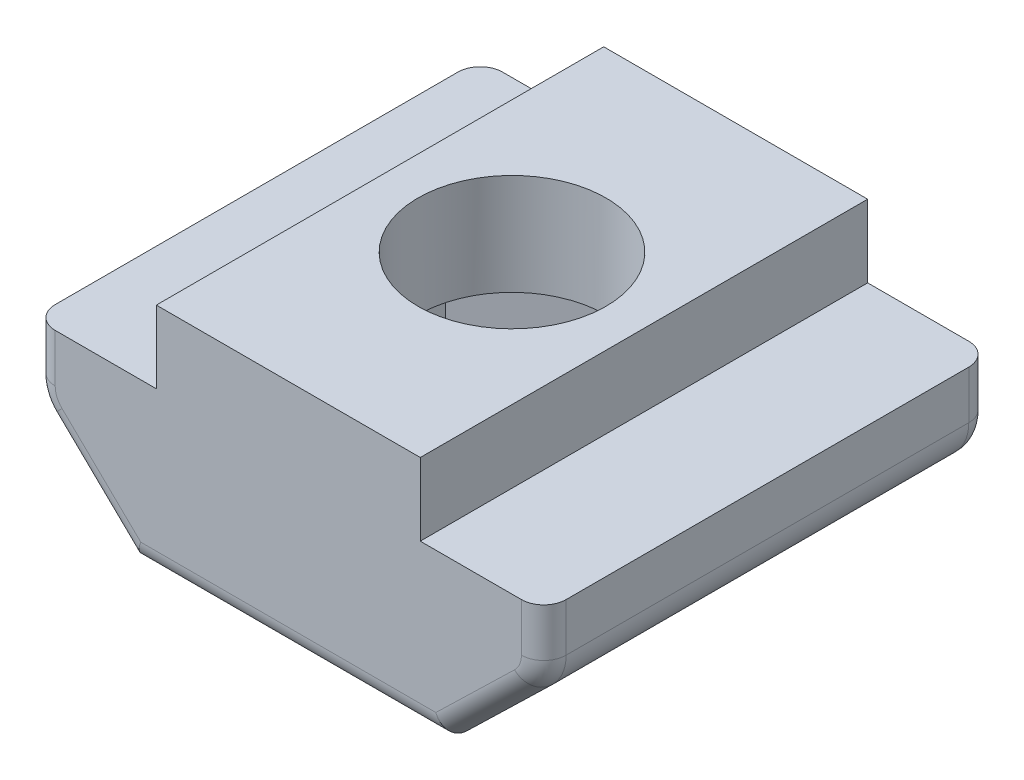
ISO-10303-21;
HEADER;
FILE_DESCRIPTION(('STEP AP214'),'2;1');
FILE_NAME('part.step','',(''),(''),'','','');
FILE_SCHEMA(('AUTOMOTIVE_DESIGN { 1 0 10303 214 1 1 1 1 }'));
ENDSEC;
DATA;
#1=APPLICATION_CONTEXT('core data for automotive mechanical design processes');
#2=APPLICATION_PROTOCOL_DEFINITION('international standard','automotive_design',2000,#1);
#3=PRODUCT_CONTEXT('',#1,'mechanical');
#4=PRODUCT('Part','Part','',(#3));
#5=PRODUCT_RELATED_PRODUCT_CATEGORY('part','',(#4));
#6=PRODUCT_DEFINITION_FORMATION('','',#4);
#7=PRODUCT_DEFINITION_CONTEXT('part definition',#1,'design');
#8=PRODUCT_DEFINITION('design','',#6,#7);
#9=PRODUCT_DEFINITION_SHAPE('','',#8);
#10=(LENGTH_UNIT() NAMED_UNIT(*) SI_UNIT(.MILLI.,.METRE.));
#11=(NAMED_UNIT(*) PLANE_ANGLE_UNIT() SI_UNIT($,.RADIAN.));
#12=(NAMED_UNIT(*) SI_UNIT($,.STERADIAN.) SOLID_ANGLE_UNIT());
#13=UNCERTAINTY_MEASURE_WITH_UNIT(LENGTH_MEASURE(1.E-05),#10,'distance_accuracy_value','');
#14=(GEOMETRIC_REPRESENTATION_CONTEXT(3) GLOBAL_UNCERTAINTY_ASSIGNED_CONTEXT((#13)) GLOBAL_UNIT_ASSIGNED_CONTEXT((#10,
#11,#12)) REPRESENTATION_CONTEXT('',''));
#15=CARTESIAN_POINT('',(0.,0.,0.));
#16=DIRECTION('',(0.,0.,1.));
#17=DIRECTION('',(1.,0.,0.));
#18=AXIS2_PLACEMENT_3D('',#15,#16,#17);
#19=CARTESIAN_POINT('',(0.,4.84,-10.));
#20=DIRECTION('',(0.,1.,0.));
#21=DIRECTION('',(0.,0.,1.));
#22=AXIS2_PLACEMENT_3D('',#19,#20,#21);
#23=PLANE('',#22);
#24=DIRECTION('',(0.,0.,1.));
#25=VECTOR('',#24,1.);
#26=CARTESIAN_POINT('',(-3.5,4.84,-10.));
#27=LINE('',#26,#25);
#28=CARTESIAN_POINT('',(-3.5,4.84,-2.97072594216369));
#29=VERTEX_POINT('',#28);
#30=CARTESIAN_POINT('',(-3.5,4.84,-0.5));
#31=VERTEX_POINT('',#30);
#32=EDGE_CURVE('E339',#29,#31,#27,.T.);
#33=ORIENTED_EDGE('',*,*,#32,.F.);
#34=DIRECTION('',(-0.866025403784439,0.,-0.5));
#35=VECTOR('',#34,1.);
#36=CARTESIAN_POINT('',(0.,4.84,-0.95));
#37=LINE('',#36,#35);
#38=CARTESIAN_POINT('',(0.,4.84,-0.95));
#39=VERTEX_POINT('',#38);
#40=EDGE_CURVE('E56',#39,#29,#37,.T.);
#41=ORIENTED_EDGE('',*,*,#40,.F.);
#42=DIRECTION('',(-0.866025403784439,0.,0.5));
#43=VECTOR('',#42,1.);
#44=CARTESIAN_POINT('',(3.50740288532698,4.84,-2.975));
#45=LINE('',#44,#43);
#46=CARTESIAN_POINT('',(3.5,4.84,-2.97072594216369));
#47=VERTEX_POINT('',#46);
#48=EDGE_CURVE('E256',#47,#39,#45,.T.);
#49=ORIENTED_EDGE('',*,*,#48,.F.);
#50=DIRECTION('',(0.,0.,1.));
#51=VECTOR('',#50,1.);
#52=CARTESIAN_POINT('',(3.5,4.84,-10.));
#53=LINE('',#52,#51);
#54=CARTESIAN_POINT('',(3.5,4.84,-0.5));
#55=VERTEX_POINT('',#54);
#56=EDGE_CURVE('E335',#47,#55,#53,.T.);
#57=ORIENTED_EDGE('',*,*,#56,.T.);
#58=DIRECTION('',(-1.,0.,0.));
#59=VECTOR('',#58,1.);
#60=CARTESIAN_POINT('',(-3.5,4.84,-0.5));
#61=LINE('',#60,#59);
#62=EDGE_CURVE('E358',#55,#31,#61,.T.);
#63=ORIENTED_EDGE('',*,*,#62,.T.);
#64=EDGE_LOOP('',(#33,#41,#49,#57,#63));
#65=FACE_BOUND('',#64,.T.);
#66=ADVANCED_FACE('F41',(#65),#23,.F.);
#67=CARTESIAN_POINT('',(0.,4.84,-5.));
#68=DIRECTION('',(0.,1.,0.));
#69=DIRECTION('',(0.,0.,1.));
#70=AXIS2_PLACEMENT_3D('',#67,#68,#69);
#71=CYLINDRICAL_SURFACE('',#70,2.1);
#72=CARTESIAN_POINT('',(0.,10.1031353824411,-5.));
#73=DIRECTION('',(0.,1.,0.));
#74=DIRECTION('',(0.,0.,1.));
#75=AXIS2_PLACEMENT_3D('',#72,#73,#74);
#76=CIRCLE('',#75,2.1);
#77=CARTESIAN_POINT('',(0.,10.1031353824411,-2.9));
#78=VERTEX_POINT('',#77);
#79=EDGE_CURVE('E288',#78,#78,#76,.T.);
#80=ORIENTED_EDGE('',*,*,#79,.T.);
#81=EDGE_LOOP('',(#80));
#82=FACE_BOUND('',#81,.T.);
#83=CARTESIAN_POINT('',(0.,7.84,-5.));
#84=DIRECTION('',(0.,-1.,0.));
#85=DIRECTION('',(0.,0.,-1.));
#86=AXIS2_PLACEMENT_3D('',#83,#84,#85);
#87=CIRCLE('',#86,2.1);
#88=CARTESIAN_POINT('',(0.,7.84,-7.1));
#89=VERTEX_POINT('',#88);
#90=EDGE_CURVE('E272',#89,#89,#87,.F.);
#91=ORIENTED_EDGE('',*,*,#90,.F.);
#92=EDGE_LOOP('',(#91));
#93=FACE_BOUND('',#92,.T.);
#94=ADVANCED_FACE('F529',(#82,#93),#71,.F.);
#95=CARTESIAN_POINT('',(0.,0.,-10.));
#96=DIRECTION('',(0.,0.,1.));
#97=DIRECTION('',(1.,0.,0.));
#98=AXIS2_PLACEMENT_3D('',#95,#96,#97);
#99=PLANE('',#98);
#100=CARTESIAN_POINT('',(4.71,7.40637486689301,-10.));
#101=DIRECTION('',(0.,0.,1.));
#102=DIRECTION('',(1.,0.,0.));
#103=AXIS2_PLACEMENT_3D('',#100,#101,#102);
#104=CIRCLE('',#103,0.5);
#105=CARTESIAN_POINT('',(5.05808171377831,7.0474331995804,-10.));
#106=VERTEX_POINT('',#105);
#107=CARTESIAN_POINT('',(5.21,7.40637486689301,-10.));
#108=VERTEX_POINT('',#107);
#109=EDGE_CURVE('E427',#106,#108,#104,.T.);
#110=ORIENTED_EDGE('',*,*,#109,.F.);
#111=DIRECTION('',(-0.717883334625219,-0.696163427556616,0.));
#112=VECTOR('',#111,1.);
#113=CARTESIAN_POINT('',(-1.07068775568387,1.10409261096988,-10.));
#114=LINE('',#113,#112);
#115=CARTESIAN_POINT('',(3.29737755948704,5.34,-10.));
#116=VERTEX_POINT('',#115);
#117=EDGE_CURVE('E348',#106,#116,#114,.T.);
#118=ORIENTED_EDGE('',*,*,#117,.T.);
#119=DIRECTION('',(-1.,0.,0.));
#120=VECTOR('',#119,1.);
#121=CARTESIAN_POINT('',(0.,5.34,-10.));
#122=LINE('',#121,#120);
#123=CARTESIAN_POINT('',(-3.29737755948704,5.34,-10.));
#124=VERTEX_POINT('',#123);
#125=EDGE_CURVE('E350',#116,#124,#122,.T.);
#126=ORIENTED_EDGE('',*,*,#125,.T.);
#127=DIRECTION('',(0.717883334625219,-0.696163427556616,0.));
#128=VECTOR('',#127,1.);
#129=CARTESIAN_POINT('',(-5.36191828622169,7.34207704975373,-10.));
#130=LINE('',#129,#128);
#131=CARTESIAN_POINT('',(-5.05808171377831,7.0474331995804,-10.));
#132=VERTEX_POINT('',#131);
#133=EDGE_CURVE('E353',#124,#132,#130,.F.);
#134=ORIENTED_EDGE('',*,*,#133,.T.);
#135=CARTESIAN_POINT('',(-4.71,7.40637486689301,-10.));
#136=DIRECTION('',(0.,0.,1.));
#137=DIRECTION('',(1.,0.,0.));
#138=AXIS2_PLACEMENT_3D('',#135,#136,#137);
#139=CIRCLE('',#138,0.5);
#140=CARTESIAN_POINT('',(-5.21,7.40637486689301,-10.));
#141=VERTEX_POINT('',#140);
#142=EDGE_CURVE('E424',#141,#132,#139,.T.);
#143=ORIENTED_EDGE('',*,*,#142,.F.);
#144=DIRECTION('',(0.,-1.,0.));
#145=VECTOR('',#144,1.);
#146=CARTESIAN_POINT('',(-5.21,8.48313538244112,-10.));
#147=LINE('',#146,#145);
#148=CARTESIAN_POINT('',(-5.21,8.48313538244112,-10.));
#149=VERTEX_POINT('',#148);
#150=EDGE_CURVE('E356',#141,#149,#147,.F.);
#151=ORIENTED_EDGE('',*,*,#150,.T.);
#152=DIRECTION('',(-1.,0.,0.));
#153=VECTOR('',#152,1.);
#154=CARTESIAN_POINT('',(0.,8.48313538244112,-10.));
#155=LINE('',#154,#153);
#156=CARTESIAN_POINT('',(-2.95,8.48313538244112,-10.));
#157=VERTEX_POINT('',#156);
#158=EDGE_CURVE('E299',#157,#149,#155,.T.);
#159=ORIENTED_EDGE('',*,*,#158,.F.);
#160=DIRECTION('',(0.,-1.,0.));
#161=VECTOR('',#160,1.);
#162=CARTESIAN_POINT('',(-2.95,0.,-10.));
#163=LINE('',#162,#161);
#164=CARTESIAN_POINT('',(-2.95,10.1031353824411,-10.));
#165=VERTEX_POINT('',#164);
#166=EDGE_CURVE('E295',#165,#157,#163,.T.);
#167=ORIENTED_EDGE('',*,*,#166,.F.);
#168=DIRECTION('',(1.,0.,0.));
#169=VECTOR('',#168,1.);
#170=CARTESIAN_POINT('',(0.,10.1031353824411,-10.));
#171=LINE('',#170,#169);
#172=CARTESIAN_POINT('',(2.95,10.1031353824411,-10.));
#173=VERTEX_POINT('',#172);
#174=EDGE_CURVE('E292',#165,#173,#171,.T.);
#175=ORIENTED_EDGE('',*,*,#174,.T.);
#176=DIRECTION('',(0.,-1.,0.));
#177=VECTOR('',#176,1.);
#178=CARTESIAN_POINT('',(2.95,0.,-10.));
#179=LINE('',#178,#177);
#180=CARTESIAN_POINT('',(2.95,8.48313538244112,-10.));
#181=VERTEX_POINT('',#180);
#182=EDGE_CURVE('E305',#173,#181,#179,.T.);
#183=ORIENTED_EDGE('',*,*,#182,.T.);
#184=DIRECTION('',(1.,0.,0.));
#185=VECTOR('',#184,1.);
#186=CARTESIAN_POINT('',(0.,8.48313538244112,-10.));
#187=LINE('',#186,#185);
#188=CARTESIAN_POINT('',(5.21,8.48313538244112,-10.));
#189=VERTEX_POINT('',#188);
#190=EDGE_CURVE('E302',#181,#189,#187,.T.);
#191=ORIENTED_EDGE('',*,*,#190,.T.);
#192=DIRECTION('',(0.,-1.,0.));
#193=VECTOR('',#192,1.);
#194=CARTESIAN_POINT('',(5.21,0.,-10.));
#195=LINE('',#194,#193);
#196=EDGE_CURVE('E325',#189,#108,#195,.T.);
#197=ORIENTED_EDGE('',*,*,#196,.T.);
#198=EDGE_LOOP('',(#110,#118,#126,#134,#143,#151,#159,#167,#175,#183,#191,#197));
#199=FACE_BOUND('',#198,.T.);
#200=ADVANCED_FACE('F512',(#199),#99,.F.);
#201=CARTESIAN_POINT('',(0.,0.,0.));
#202=DIRECTION('',(0.,0.,1.));
#203=DIRECTION('',(1.,0.,0.));
#204=AXIS2_PLACEMENT_3D('',#201,#202,#203);
#205=PLANE('',#204);
#206=CARTESIAN_POINT('',(4.71,7.40637486689301,0.));
#207=DIRECTION('',(0.,0.,1.));
#208=DIRECTION('',(1.,0.,0.));
#209=AXIS2_PLACEMENT_3D('',#206,#207,#208);
#210=CIRCLE('',#209,0.5);
#211=CARTESIAN_POINT('',(5.21,7.40637486689301,0.));
#212=VERTEX_POINT('',#211);
#213=CARTESIAN_POINT('',(5.05808171377831,7.0474331995804,0.));
#214=VERTEX_POINT('',#213);
#215=EDGE_CURVE('E417',#212,#214,#210,.F.);
#216=ORIENTED_EDGE('',*,*,#215,.F.);
#217=DIRECTION('',(0.,-1.,0.));
#218=VECTOR('',#217,1.);
#219=CARTESIAN_POINT('',(5.21,8.48313538244112,0.));
#220=LINE('',#219,#218);
#221=CARTESIAN_POINT('',(5.21,8.48313538244112,0.));
#222=VERTEX_POINT('',#221);
#223=EDGE_CURVE('E391',#212,#222,#220,.F.);
#224=ORIENTED_EDGE('',*,*,#223,.T.);
#225=DIRECTION('',(1.,0.,0.));
#226=VECTOR('',#225,1.);
#227=CARTESIAN_POINT('',(0.,8.48313538244112,0.));
#228=LINE('',#227,#226);
#229=CARTESIAN_POINT('',(2.95,8.48313538244112,0.));
#230=VERTEX_POINT('',#229);
#231=EDGE_CURVE('E318',#230,#222,#228,.T.);
#232=ORIENTED_EDGE('',*,*,#231,.F.);
#233=DIRECTION('',(0.,-1.,0.));
#234=VECTOR('',#233,1.);
#235=CARTESIAN_POINT('',(2.95,0.,0.));
#236=LINE('',#235,#234);
#237=CARTESIAN_POINT('',(2.95,10.1031353824411,0.));
#238=VERTEX_POINT('',#237);
#239=EDGE_CURVE('E296',#238,#230,#236,.T.);
#240=ORIENTED_EDGE('',*,*,#239,.F.);
#241=DIRECTION('',(1.,0.,0.));
#242=VECTOR('',#241,1.);
#243=CARTESIAN_POINT('',(0.,10.1031353824411,0.));
#244=LINE('',#243,#242);
#245=CARTESIAN_POINT('',(-2.95,10.1031353824411,0.));
#246=VERTEX_POINT('',#245);
#247=EDGE_CURVE('E308',#246,#238,#244,.T.);
#248=ORIENTED_EDGE('',*,*,#247,.F.);
#249=DIRECTION('',(0.,-1.,0.));
#250=VECTOR('',#249,1.);
#251=CARTESIAN_POINT('',(-2.95,0.,0.));
#252=LINE('',#251,#250);
#253=CARTESIAN_POINT('',(-2.95,8.48313538244112,0.));
#254=VERTEX_POINT('',#253);
#255=EDGE_CURVE('E311',#246,#254,#252,.T.);
#256=ORIENTED_EDGE('',*,*,#255,.T.);
#257=DIRECTION('',(-1.,0.,0.));
#258=VECTOR('',#257,1.);
#259=CARTESIAN_POINT('',(0.,8.48313538244112,0.));
#260=LINE('',#259,#258);
#261=CARTESIAN_POINT('',(-5.21,8.48313538244112,0.));
#262=VERTEX_POINT('',#261);
#263=EDGE_CURVE('E315',#254,#262,#260,.T.);
#264=ORIENTED_EDGE('',*,*,#263,.T.);
#265=DIRECTION('',(0.,-1.,0.));
#266=VECTOR('',#265,1.);
#267=CARTESIAN_POINT('',(-5.21,0.,0.));
#268=LINE('',#267,#266);
#269=CARTESIAN_POINT('',(-5.21,7.40637486689301,0.));
#270=VERTEX_POINT('',#269);
#271=EDGE_CURVE('E400',#262,#270,#268,.T.);
#272=ORIENTED_EDGE('',*,*,#271,.T.);
#273=CARTESIAN_POINT('',(-4.71,7.40637486689301,0.));
#274=DIRECTION('',(0.,0.,1.));
#275=DIRECTION('',(1.,0.,0.));
#276=AXIS2_PLACEMENT_3D('',#273,#274,#275);
#277=CIRCLE('',#276,0.5);
#278=CARTESIAN_POINT('',(-5.05808171377831,7.0474331995804,0.));
#279=VERTEX_POINT('',#278);
#280=EDGE_CURVE('E403',#279,#270,#277,.F.);
#281=ORIENTED_EDGE('',*,*,#280,.F.);
#282=DIRECTION('',(0.717883334625219,-0.696163427556616,0.));
#283=VECTOR('',#282,1.);
#284=CARTESIAN_POINT('',(1.07068775568387,1.10409261096988,0.));
#285=LINE('',#284,#283);
#286=CARTESIAN_POINT('',(-3.29737755948704,5.34,0.));
#287=VERTEX_POINT('',#286);
#288=EDGE_CURVE('E398',#279,#287,#285,.T.);
#289=ORIENTED_EDGE('',*,*,#288,.T.);
#290=DIRECTION('',(-1.,0.,0.));
#291=VECTOR('',#290,1.);
#292=CARTESIAN_POINT('',(3.5,5.34,0.));
#293=LINE('',#292,#291);
#294=CARTESIAN_POINT('',(3.29737755948704,5.34,0.));
#295=VERTEX_POINT('',#294);
#296=EDGE_CURVE('E396',#287,#295,#293,.F.);
#297=ORIENTED_EDGE('',*,*,#296,.T.);
#298=DIRECTION('',(-0.717883334625219,-0.696163427556616,0.));
#299=VECTOR('',#298,1.);
#300=CARTESIAN_POINT('',(5.36191828622169,7.34207704975373,0.));
#301=LINE('',#300,#299);
#302=EDGE_CURVE('E393',#295,#214,#301,.F.);
#303=ORIENTED_EDGE('',*,*,#302,.T.);
#304=EDGE_LOOP('',(#216,#224,#232,#240,#248,#256,#264,#272,#281,#289,#297,#303));
#305=FACE_BOUND('',#304,.T.);
#306=ADVANCED_FACE('F501',(#305),#205,.T.);
#307=CARTESIAN_POINT('',(0.,10.1031353824411,-10.));
#308=DIRECTION('',(0.,-1.,0.));
#309=DIRECTION('',(0.,0.,-1.));
#310=AXIS2_PLACEMENT_3D('',#307,#308,#309);
#311=PLANE('',#310);
#312=ORIENTED_EDGE('',*,*,#79,.F.);
#313=EDGE_LOOP('',(#312));
#314=FACE_BOUND('',#313,.T.);
#315=ORIENTED_EDGE('',*,*,#247,.T.);
#316=DIRECTION('',(0.,0.,1.));
#317=VECTOR('',#316,1.);
#318=CARTESIAN_POINT('',(2.95,10.1031353824411,-10.));
#319=LINE('',#318,#317);
#320=EDGE_CURVE('E322',#173,#238,#319,.T.);
#321=ORIENTED_EDGE('',*,*,#320,.F.);
#322=ORIENTED_EDGE('',*,*,#174,.F.);
#323=DIRECTION('',(0.,0.,1.));
#324=VECTOR('',#323,1.);
#325=CARTESIAN_POINT('',(-2.95,10.1031353824411,-10.));
#326=LINE('',#325,#324);
#327=EDGE_CURVE('E307',#165,#246,#326,.T.);
#328=ORIENTED_EDGE('',*,*,#327,.T.);
#329=EDGE_LOOP('',(#315,#321,#322,#328));
#330=FACE_BOUND('',#329,.T.);
#331=ADVANCED_FACE('F563',(#314,#330),#311,.F.);
#332=CARTESIAN_POINT('',(2.95,0.,-10.));
#333=DIRECTION('',(-1.,0.,0.));
#334=DIRECTION('',(0.,0.,1.));
#335=AXIS2_PLACEMENT_3D('',#332,#333,#334);
#336=PLANE('',#335);
#337=ORIENTED_EDGE('',*,*,#239,.T.);
#338=DIRECTION('',(0.,0.,1.));
#339=VECTOR('',#338,1.);
#340=CARTESIAN_POINT('',(2.95,8.48313538244112,-10.));
#341=LINE('',#340,#339);
#342=EDGE_CURVE('E326',#181,#230,#341,.T.);
#343=ORIENTED_EDGE('',*,*,#342,.F.);
#344=ORIENTED_EDGE('',*,*,#182,.F.);
#345=ORIENTED_EDGE('',*,*,#320,.T.);
#346=EDGE_LOOP('',(#337,#343,#344,#345));
#347=FACE_BOUND('',#346,.T.);
#348=ADVANCED_FACE('F559',(#347),#336,.F.);
#349=CARTESIAN_POINT('',(0.,8.48313538244112,-10.));
#350=DIRECTION('',(0.,-1.,0.));
#351=DIRECTION('',(0.,0.,-1.));
#352=AXIS2_PLACEMENT_3D('',#349,#350,#351);
#353=PLANE('',#352);
#354=DIRECTION('',(0.,0.,1.));
#355=VECTOR('',#354,1.);
#356=CARTESIAN_POINT('',(5.71,8.48313538244112,-10.));
#357=LINE('',#356,#355);
#358=CARTESIAN_POINT('',(5.71,8.48313538244112,-9.5));
#359=VERTEX_POINT('',#358);
#360=CARTESIAN_POINT('',(5.71,8.48313538244112,-0.5));
#361=VERTEX_POINT('',#360);
#362=EDGE_CURVE('E329',#359,#361,#357,.T.);
#363=ORIENTED_EDGE('',*,*,#362,.F.);
#364=CARTESIAN_POINT('',(5.21,8.48313538244112,-9.5));
#365=DIRECTION('',(0.,-1.,0.));
#366=DIRECTION('',(0.,0.,-1.));
#367=AXIS2_PLACEMENT_3D('',#364,#365,#366);
#368=CIRCLE('',#367,0.5);
#369=EDGE_CURVE('E389',#359,#189,#368,.F.);
#370=ORIENTED_EDGE('',*,*,#369,.T.);
#371=ORIENTED_EDGE('',*,*,#190,.F.);
#372=ORIENTED_EDGE('',*,*,#342,.T.);
#373=ORIENTED_EDGE('',*,*,#231,.T.);
#374=CARTESIAN_POINT('',(5.21,8.48313538244112,-0.5));
#375=DIRECTION('',(0.,-1.,0.));
#376=DIRECTION('',(0.,0.,-1.));
#377=AXIS2_PLACEMENT_3D('',#374,#375,#376);
#378=CIRCLE('',#377,0.5);
#379=EDGE_CURVE('E387',#222,#361,#378,.F.);
#380=ORIENTED_EDGE('',*,*,#379,.T.);
#381=EDGE_LOOP('',(#363,#370,#371,#372,#373,#380));
#382=FACE_BOUND('',#381,.T.);
#383=ADVANCED_FACE('F552',(#382),#353,.F.);
#384=CARTESIAN_POINT('',(5.71,0.,-10.));
#385=DIRECTION('',(-1.,0.,0.));
#386=DIRECTION('',(0.,0.,1.));
#387=AXIS2_PLACEMENT_3D('',#384,#385,#386);
#388=PLANE('',#387);
#389=DIRECTION('',(0.,-1.,0.));
#390=VECTOR('',#389,1.);
#391=CARTESIAN_POINT('',(5.71,6.98313538244112,-0.5));
#392=LINE('',#391,#390);
#393=CARTESIAN_POINT('',(5.71,7.40637486689301,-0.5));
#394=VERTEX_POINT('',#393);
#395=EDGE_CURVE('E383',#361,#394,#392,.T.);
#396=ORIENTED_EDGE('',*,*,#395,.T.);
#397=DIRECTION('',(0.,0.,1.));
#398=VECTOR('',#397,1.);
#399=CARTESIAN_POINT('',(5.71,7.40637486689301,-10.));
#400=LINE('',#399,#398);
#401=CARTESIAN_POINT('',(5.71,7.40637486689301,-9.5));
#402=VERTEX_POINT('',#401);
#403=EDGE_CURVE('E447',#394,#402,#400,.F.);
#404=ORIENTED_EDGE('',*,*,#403,.T.);
#405=DIRECTION('',(0.,-1.,0.));
#406=VECTOR('',#405,1.);
#407=CARTESIAN_POINT('',(5.71,0.,-9.5));
#408=LINE('',#407,#406);
#409=EDGE_CURVE('E385',#402,#359,#408,.F.);
#410=ORIENTED_EDGE('',*,*,#409,.T.);
#411=ORIENTED_EDGE('',*,*,#362,.T.);
#412=EDGE_LOOP('',(#396,#404,#410,#411));
#413=FACE_BOUND('',#412,.T.);
#414=ADVANCED_FACE('F547',(#413),#388,.F.);
#415=CARTESIAN_POINT('',(-0.722606041905558,0.745150943657271,-10.));
#416=DIRECTION('',(-0.696163427556616,0.717883334625219,0.));
#417=DIRECTION('',(-0.717883334625219,-0.696163427556616,0.));
#418=AXIS2_PLACEMENT_3D('',#415,#416,#417);
#419=PLANE('',#418);
#420=ORIENTED_EDGE('',*,*,#56,.F.);
#421=DIRECTION('',(0.66317754509688,0.643112788116544,-0.382885734182199));
#422=VECTOR('',#421,1.);
#423=CARTESIAN_POINT('',(1.68131612951637,3.07634128854823,-1.92070831996914));
#424=LINE('',#423,#422);
#425=CARTESIAN_POINT('',(3.50740288532698,4.84717890745538,-2.975));
#426=VERTEX_POINT('',#425);
#427=EDGE_CURVE('E285',#47,#426,#424,.T.);
#428=ORIENTED_EDGE('',*,*,#427,.T.);
#429=DIRECTION('',(0.,0.,-1.));
#430=VECTOR('',#429,1.);
#431=CARTESIAN_POINT('',(3.50740288532698,4.84717890745538,-10.));
#432=LINE('',#431,#430);
#433=CARTESIAN_POINT('',(3.50740288532698,4.84717890745539,-7.025));
#434=VERTEX_POINT('',#433);
#435=EDGE_CURVE('E11',#426,#434,#432,.T.);
#436=ORIENTED_EDGE('',*,*,#435,.T.);
#437=DIRECTION('',(-0.66317754509688,-0.643112788116544,-0.382885734182199));
#438=VECTOR('',#437,1.);
#439=CARTESIAN_POINT('',(-0.857896082959299,0.613954168148591,-9.54530653443328));
#440=LINE('',#439,#438);
#441=CARTESIAN_POINT('',(3.5,4.84,-7.02927405783631));
#442=VERTEX_POINT('',#441);
#443=EDGE_CURVE('E282',#434,#442,#440,.T.);
#444=ORIENTED_EDGE('',*,*,#443,.T.);
#445=CARTESIAN_POINT('',(3.5,4.84,-9.5));
#446=VERTEX_POINT('',#445);
#447=EDGE_CURVE('E332',#446,#442,#53,.T.);
#448=ORIENTED_EDGE('',*,*,#447,.F.);
#449=DIRECTION('',(-0.717883334625219,-0.696163427556616,0.));
#450=VECTOR('',#449,1.);
#451=CARTESIAN_POINT('',(-0.722606041905558,0.745150943657271,-9.5));
#452=LINE('',#451,#450);
#453=CARTESIAN_POINT('',(5.40616342755662,6.68849153226779,-9.5));
#454=VERTEX_POINT('',#453);
#455=EDGE_CURVE('E380',#446,#454,#452,.F.);
#456=ORIENTED_EDGE('',*,*,#455,.T.);
#457=DIRECTION('',(0.,0.,1.));
#458=VECTOR('',#457,1.);
#459=CARTESIAN_POINT('',(5.40616342755662,6.68849153226779,-10.));
#460=LINE('',#459,#458);
#461=CARTESIAN_POINT('',(5.40616342755662,6.68849153226779,-0.5));
#462=VERTEX_POINT('',#461);
#463=EDGE_CURVE('E445',#454,#462,#460,.T.);
#464=ORIENTED_EDGE('',*,*,#463,.T.);
#465=DIRECTION('',(-0.717883334625219,-0.696163427556616,0.));
#466=VECTOR('',#465,1.);
#467=CARTESIAN_POINT('',(3.5,4.84,-0.5));
#468=LINE('',#467,#466);
#469=EDGE_CURVE('E377',#462,#55,#468,.T.);
#470=ORIENTED_EDGE('',*,*,#469,.T.);
#471=EDGE_LOOP('',(#420,#428,#436,#444,#448,#456,#464,#470));
#472=FACE_BOUND('',#471,.T.);
#473=ADVANCED_FACE('F542',(#472),#419,.F.);
#474=DIRECTION('',(0.866025403784438,0.,0.5));
#475=VECTOR('',#474,1.);
#476=CARTESIAN_POINT('',(0.,4.84,-9.05));
#477=LINE('',#476,#475);
#478=CARTESIAN_POINT('',(0.,4.84,-9.05));
#479=VERTEX_POINT('',#478);
#480=EDGE_CURVE('E267',#479,#442,#477,.T.);
#481=ORIENTED_EDGE('',*,*,#480,.F.);
#482=DIRECTION('',(0.866025403784439,0.,-0.5));
#483=VECTOR('',#482,1.);
#484=CARTESIAN_POINT('',(-3.50740288532698,4.84,-7.025));
#485=LINE('',#484,#483);
#486=CARTESIAN_POINT('',(-3.5,4.84,-7.02927405783631));
#487=VERTEX_POINT('',#486);
#488=EDGE_CURVE('E236',#487,#479,#485,.T.);
#489=ORIENTED_EDGE('',*,*,#488,.F.);
#490=CARTESIAN_POINT('',(-3.5,4.84,-9.5));
#491=VERTEX_POINT('',#490);
#492=EDGE_CURVE('E336',#491,#487,#27,.T.);
#493=ORIENTED_EDGE('',*,*,#492,.F.);
#494=DIRECTION('',(-1.,0.,0.));
#495=VECTOR('',#494,1.);
#496=CARTESIAN_POINT('',(0.,4.84,-9.5));
#497=LINE('',#496,#495);
#498=EDGE_CURVE('E361',#491,#446,#497,.F.);
#499=ORIENTED_EDGE('',*,*,#498,.T.);
#500=ORIENTED_EDGE('',*,*,#447,.T.);
#501=EDGE_LOOP('',(#481,#489,#493,#499,#500));
#502=FACE_BOUND('',#501,.T.);
#503=ADVANCED_FACE('F469',(#502),#23,.F.);
#504=CARTESIAN_POINT('',(0.722606041905558,0.745150943657271,-10.));
#505=DIRECTION('',(-0.696163427556616,-0.717883334625219,0.));
#506=DIRECTION('',(0.717883334625219,-0.696163427556616,0.));
#507=AXIS2_PLACEMENT_3D('',#504,#505,#506);
#508=PLANE('',#507);
#509=DIRECTION('',(0.66317754509688,-0.643112788116544,-0.382885734182199));
#510=VECTOR('',#509,1.);
#511=CARTESIAN_POINT('',(0.857896082959299,0.613954168148591,-9.54530653443328));
#512=LINE('',#511,#510);
#513=CARTESIAN_POINT('',(-3.50740288532698,4.84717890745538,-7.025));
#514=VERTEX_POINT('',#513);
#515=EDGE_CURVE('E49',#514,#487,#512,.T.);
#516=ORIENTED_EDGE('',*,*,#515,.F.);
#517=DIRECTION('',(0.,0.,-1.));
#518=VECTOR('',#517,1.);
#519=CARTESIAN_POINT('',(-3.50740288532698,4.84717890745538,-10.));
#520=LINE('',#519,#518);
#521=CARTESIAN_POINT('',(-3.50740288532698,4.84717890745538,-2.975));
#522=VERTEX_POINT('',#521);
#523=EDGE_CURVE('E463',#522,#514,#520,.T.);
#524=ORIENTED_EDGE('',*,*,#523,.F.);
#525=DIRECTION('',(-0.66317754509688,0.643112788116544,-0.382885734182199));
#526=VECTOR('',#525,1.);
#527=CARTESIAN_POINT('',(-1.68131612951637,3.07634128854823,-1.92070831996914));
#528=LINE('',#527,#526);
#529=EDGE_CURVE('E449',#29,#522,#528,.T.);
#530=ORIENTED_EDGE('',*,*,#529,.F.);
#531=ORIENTED_EDGE('',*,*,#32,.T.);
#532=DIRECTION('',(0.717883334625219,-0.696163427556616,0.));
#533=VECTOR('',#532,1.);
#534=CARTESIAN_POINT('',(0.722606041905558,0.745150943657271,-0.5));
#535=LINE('',#534,#533);
#536=CARTESIAN_POINT('',(-5.40616342755662,6.68849153226779,-0.5));
#537=VERTEX_POINT('',#536);
#538=EDGE_CURVE('E363',#31,#537,#535,.F.);
#539=ORIENTED_EDGE('',*,*,#538,.T.);
#540=DIRECTION('',(0.,0.,1.));
#541=VECTOR('',#540,1.);
#542=CARTESIAN_POINT('',(-5.40616342755662,6.68849153226779,-10.));
#543=LINE('',#542,#541);
#544=CARTESIAN_POINT('',(-5.40616342755662,6.68849153226779,-9.5));
#545=VERTEX_POINT('',#544);
#546=EDGE_CURVE('E443',#537,#545,#543,.F.);
#547=ORIENTED_EDGE('',*,*,#546,.T.);
#548=DIRECTION('',(0.717883334625219,-0.696163427556616,0.));
#549=VECTOR('',#548,1.);
#550=CARTESIAN_POINT('',(-3.5,4.84,-9.5));
#551=LINE('',#550,#549);
#552=EDGE_CURVE('E366',#545,#491,#551,.T.);
#553=ORIENTED_EDGE('',*,*,#552,.T.);
#554=ORIENTED_EDGE('',*,*,#492,.T.);
#555=EDGE_LOOP('',(#516,#524,#530,#531,#539,#547,#553,#554));
#556=FACE_BOUND('',#555,.T.);
#557=ADVANCED_FACE('F471',(#556),#508,.T.);
#558=CARTESIAN_POINT('',(-5.71,0.,-10.));
#559=DIRECTION('',(-1.,0.,0.));
#560=DIRECTION('',(0.,0.,1.));
#561=AXIS2_PLACEMENT_3D('',#558,#559,#560);
#562=PLANE('',#561);
#563=DIRECTION('',(0.,-1.,0.));
#564=VECTOR('',#563,1.);
#565=CARTESIAN_POINT('',(-5.71,6.98313538244112,-9.5));
#566=LINE('',#565,#564);
#567=CARTESIAN_POINT('',(-5.71,8.48313538244112,-9.5));
#568=VERTEX_POINT('',#567);
#569=CARTESIAN_POINT('',(-5.71,7.40637486689301,-9.5));
#570=VERTEX_POINT('',#569);
#571=EDGE_CURVE('E370',#568,#570,#566,.T.);
#572=ORIENTED_EDGE('',*,*,#571,.T.);
#573=DIRECTION('',(0.,0.,1.));
#574=VECTOR('',#573,1.);
#575=CARTESIAN_POINT('',(-5.71,7.40637486689301,-10.));
#576=LINE('',#575,#574);
#577=CARTESIAN_POINT('',(-5.71,7.40637486689301,-0.5));
#578=VERTEX_POINT('',#577);
#579=EDGE_CURVE('E441',#570,#578,#576,.T.);
#580=ORIENTED_EDGE('',*,*,#579,.T.);
#581=DIRECTION('',(0.,-1.,0.));
#582=VECTOR('',#581,1.);
#583=CARTESIAN_POINT('',(-5.71,0.,-0.5));
#584=LINE('',#583,#582);
#585=CARTESIAN_POINT('',(-5.71,8.48313538244112,-0.5));
#586=VERTEX_POINT('',#585);
#587=EDGE_CURVE('E368',#578,#586,#584,.F.);
#588=ORIENTED_EDGE('',*,*,#587,.T.);
#589=DIRECTION('',(0.,0.,1.));
#590=VECTOR('',#589,1.);
#591=CARTESIAN_POINT('',(-5.71,8.48313538244112,-10.));
#592=LINE('',#591,#590);
#593=EDGE_CURVE('E340',#568,#586,#592,.T.);
#594=ORIENTED_EDGE('',*,*,#593,.F.);
#595=EDGE_LOOP('',(#572,#580,#588,#594));
#596=FACE_BOUND('',#595,.T.);
#597=ADVANCED_FACE('F489',(#596),#562,.T.);
#598=CARTESIAN_POINT('',(0.,8.48313538244112,-10.));
#599=DIRECTION('',(0.,1.,0.));
#600=DIRECTION('',(0.,0.,1.));
#601=AXIS2_PLACEMENT_3D('',#598,#599,#600);
#602=PLANE('',#601);
#603=ORIENTED_EDGE('',*,*,#158,.T.);
#604=CARTESIAN_POINT('',(-5.21,8.48313538244112,-9.5));
#605=DIRECTION('',(0.,1.,0.));
#606=DIRECTION('',(0.,0.,1.));
#607=AXIS2_PLACEMENT_3D('',#604,#605,#606);
#608=CIRCLE('',#607,0.5);
#609=EDGE_CURVE('E375',#149,#568,#608,.T.);
#610=ORIENTED_EDGE('',*,*,#609,.T.);
#611=ORIENTED_EDGE('',*,*,#593,.T.);
#612=CARTESIAN_POINT('',(-5.21,8.48313538244112,-0.5));
#613=DIRECTION('',(0.,1.,0.));
#614=DIRECTION('',(0.,0.,1.));
#615=AXIS2_PLACEMENT_3D('',#612,#613,#614);
#616=CIRCLE('',#615,0.5);
#617=EDGE_CURVE('E373',#586,#262,#616,.T.);
#618=ORIENTED_EDGE('',*,*,#617,.T.);
#619=ORIENTED_EDGE('',*,*,#263,.F.);
#620=DIRECTION('',(0.,0.,1.));
#621=VECTOR('',#620,1.);
#622=CARTESIAN_POINT('',(-2.95,8.48313538244112,-10.));
#623=LINE('',#622,#621);
#624=EDGE_CURVE('E343',#157,#254,#623,.T.);
#625=ORIENTED_EDGE('',*,*,#624,.F.);
#626=EDGE_LOOP('',(#603,#610,#611,#618,#619,#625));
#627=FACE_BOUND('',#626,.T.);
#628=ADVANCED_FACE('F498',(#627),#602,.T.);
#629=CARTESIAN_POINT('',(-2.95,0.,-10.));
#630=DIRECTION('',(-1.,0.,0.));
#631=DIRECTION('',(0.,0.,1.));
#632=AXIS2_PLACEMENT_3D('',#629,#630,#631);
#633=PLANE('',#632);
#634=ORIENTED_EDGE('',*,*,#255,.F.);
#635=ORIENTED_EDGE('',*,*,#327,.F.);
#636=ORIENTED_EDGE('',*,*,#166,.T.);
#637=ORIENTED_EDGE('',*,*,#624,.T.);
#638=EDGE_LOOP('',(#634,#635,#636,#637));
#639=FACE_BOUND('',#638,.T.);
#640=ADVANCED_FACE('F506',(#639),#633,.T.);
#641=CARTESIAN_POINT('',(5.21,0.,-9.5));
#642=DIRECTION('',(0.,-1.,0.));
#643=DIRECTION('',(0.,0.,-1.));
#644=AXIS2_PLACEMENT_3D('',#641,#642,#643);
#645=CYLINDRICAL_SURFACE('',#644,0.5);
#646=ORIENTED_EDGE('',*,*,#409,.F.);
#647=CARTESIAN_POINT('',(5.21,7.40637486689301,-9.5));
#648=DIRECTION('',(0.,1.,0.));
#649=DIRECTION('',(0.,0.,1.));
#650=AXIS2_PLACEMENT_3D('',#647,#648,#649);
#651=CIRCLE('',#650,0.5);
#652=EDGE_CURVE('E422',#402,#108,#651,.T.);
#653=ORIENTED_EDGE('',*,*,#652,.T.);
#654=ORIENTED_EDGE('',*,*,#196,.F.);
#655=ORIENTED_EDGE('',*,*,#369,.F.);
#656=EDGE_LOOP('',(#646,#653,#654,#655));
#657=FACE_BOUND('',#656,.T.);
#658=ADVANCED_FACE('F518',(#657),#645,.T.);
#659=CARTESIAN_POINT('',(-5.21,0.,-9.5));
#660=DIRECTION('',(0.,1.,0.));
#661=DIRECTION('',(0.,0.,1.));
#662=AXIS2_PLACEMENT_3D('',#659,#660,#661);
#663=CYLINDRICAL_SURFACE('',#662,0.5);
#664=ORIENTED_EDGE('',*,*,#150,.F.);
#665=CARTESIAN_POINT('',(-5.21,7.40637486689301,-9.5));
#666=DIRECTION('',(0.,1.,0.));
#667=DIRECTION('',(0.,0.,1.));
#668=AXIS2_PLACEMENT_3D('',#665,#666,#667);
#669=CIRCLE('',#668,0.5);
#670=EDGE_CURVE('E434',#141,#570,#669,.T.);
#671=ORIENTED_EDGE('',*,*,#670,.T.);
#672=ORIENTED_EDGE('',*,*,#571,.F.);
#673=ORIENTED_EDGE('',*,*,#609,.F.);
#674=EDGE_LOOP('',(#664,#671,#672,#673));
#675=FACE_BOUND('',#674,.T.);
#676=ADVANCED_FACE('F515',(#675),#663,.T.);
#677=CARTESIAN_POINT('',(-1.07068775568387,1.10409261096988,-9.5));
#678=DIRECTION('',(-0.717883334625219,-0.696163427556616,0.));
#679=DIRECTION('',(0.696163427556616,-0.717883334625219,0.));
#680=AXIS2_PLACEMENT_3D('',#677,#678,#679);
#681=CYLINDRICAL_SURFACE('',#680,0.5);
#682=ORIENTED_EDGE('',*,*,#117,.F.);
#683=CARTESIAN_POINT('',(5.05808171377831,7.0474331995804,-9.5));
#684=DIRECTION('',(-0.717883334625219,-0.696163427556616,0.));
#685=DIRECTION('',(0.696163427556616,-0.717883334625219,0.));
#686=AXIS2_PLACEMENT_3D('',#683,#684,#685);
#687=CIRCLE('',#686,0.5);
#688=EDGE_CURVE('E438',#106,#454,#687,.T.);
#689=ORIENTED_EDGE('',*,*,#688,.T.);
#690=ORIENTED_EDGE('',*,*,#455,.F.);
#691=CARTESIAN_POINT('',(3.29737755948704,5.34,-9.5));
#692=DIRECTION('',(-0.926791059145809,-0.375577332499434,0.));
#693=DIRECTION('',(0.375577332499434,-0.926791059145808,0.));
#694=AXIS2_PLACEMENT_3D('',#691,#692,#693);
#695=ELLIPSE('',#694,0.539495925285288,0.5);
#696=EDGE_CURVE('E312',#116,#446,#695,.T.);
#697=ORIENTED_EDGE('',*,*,#696,.F.);
#698=EDGE_LOOP('',(#682,#689,#690,#697));
#699=FACE_BOUND('',#698,.T.);
#700=ADVANCED_FACE('F517',(#699),#681,.T.);
#701=CARTESIAN_POINT('',(1.07068775568387,1.10409261096988,-9.5));
#702=DIRECTION('',(-0.717883334625219,0.696163427556616,0.));
#703=DIRECTION('',(-0.696163427556616,-0.717883334625219,0.));
#704=AXIS2_PLACEMENT_3D('',#701,#702,#703);
#705=CYLINDRICAL_SURFACE('',#704,0.5);
#706=ORIENTED_EDGE('',*,*,#552,.F.);
#707=CARTESIAN_POINT('',(-5.05808171377831,7.0474331995804,-9.5));
#708=DIRECTION('',(0.717883334625219,-0.696163427556616,0.));
#709=DIRECTION('',(0.696163427556616,0.717883334625219,0.));
#710=AXIS2_PLACEMENT_3D('',#707,#708,#709);
#711=CIRCLE('',#710,0.5);
#712=EDGE_CURVE('E432',#545,#132,#711,.T.);
#713=ORIENTED_EDGE('',*,*,#712,.T.);
#714=ORIENTED_EDGE('',*,*,#133,.F.);
#715=CARTESIAN_POINT('',(-3.29737755948704,5.34,-9.5));
#716=DIRECTION('',(-0.926791059145809,0.375577332499434,0.));
#717=DIRECTION('',(0.375577332499434,0.926791059145808,0.));
#718=AXIS2_PLACEMENT_3D('',#715,#716,#717);
#719=ELLIPSE('',#718,0.539495925285288,0.5);
#720=EDGE_CURVE('E404',#491,#124,#719,.F.);
#721=ORIENTED_EDGE('',*,*,#720,.F.);
#722=EDGE_LOOP('',(#706,#713,#714,#721));
#723=FACE_BOUND('',#722,.T.);
#724=ADVANCED_FACE('F477',(#723),#705,.T.);
#725=CARTESIAN_POINT('',(0.,5.34,-9.5));
#726=DIRECTION('',(-1.,0.,0.));
#727=DIRECTION('',(0.,0.,1.));
#728=AXIS2_PLACEMENT_3D('',#725,#726,#727);
#729=CYLINDRICAL_SURFACE('',#728,0.5);
#730=ORIENTED_EDGE('',*,*,#696,.T.);
#731=ORIENTED_EDGE('',*,*,#498,.F.);
#732=ORIENTED_EDGE('',*,*,#720,.T.);
#733=ORIENTED_EDGE('',*,*,#125,.F.);
#734=EDGE_LOOP('',(#730,#731,#732,#733));
#735=FACE_BOUND('',#734,.T.);
#736=ADVANCED_FACE('F747',(#735),#729,.T.);
#737=CARTESIAN_POINT('',(5.21,0.,-0.5));
#738=DIRECTION('',(0.,1.,0.));
#739=DIRECTION('',(0.,0.,1.));
#740=AXIS2_PLACEMENT_3D('',#737,#738,#739);
#741=CYLINDRICAL_SURFACE('',#740,0.5);
#742=ORIENTED_EDGE('',*,*,#223,.F.);
#743=CARTESIAN_POINT('',(5.21,7.40637486689301,-0.5));
#744=DIRECTION('',(0.,1.,0.));
#745=DIRECTION('',(0.,0.,1.));
#746=AXIS2_PLACEMENT_3D('',#743,#744,#745);
#747=CIRCLE('',#746,0.5);
#748=EDGE_CURVE('E64',#212,#394,#747,.T.);
#749=ORIENTED_EDGE('',*,*,#748,.T.);
#750=ORIENTED_EDGE('',*,*,#395,.F.);
#751=ORIENTED_EDGE('',*,*,#379,.F.);
#752=EDGE_LOOP('',(#742,#749,#750,#751));
#753=FACE_BOUND('',#752,.T.);
#754=ADVANCED_FACE('F738',(#753),#741,.T.);
#755=CARTESIAN_POINT('',(-1.07068775568387,1.10409261096988,-0.5));
#756=DIRECTION('',(0.717883334625219,0.696163427556616,0.));
#757=DIRECTION('',(-0.696163427556616,0.717883334625219,0.));
#758=AXIS2_PLACEMENT_3D('',#755,#756,#757);
#759=CYLINDRICAL_SURFACE('',#758,0.5);
#760=ORIENTED_EDGE('',*,*,#469,.F.);
#761=CARTESIAN_POINT('',(5.05808171377831,7.0474331995804,-0.5));
#762=DIRECTION('',(-0.717883334625219,-0.696163427556616,0.));
#763=DIRECTION('',(0.696163427556616,-0.717883334625219,0.));
#764=AXIS2_PLACEMENT_3D('',#761,#762,#763);
#765=CIRCLE('',#764,0.5);
#766=EDGE_CURVE('E420',#462,#214,#765,.T.);
#767=ORIENTED_EDGE('',*,*,#766,.T.);
#768=ORIENTED_EDGE('',*,*,#302,.F.);
#769=CARTESIAN_POINT('',(3.29737755948704,5.34,-0.5));
#770=DIRECTION('',(0.926791059145809,0.375577332499434,0.));
#771=DIRECTION('',(-0.375577332499434,0.926791059145808,0.));
#772=AXIS2_PLACEMENT_3D('',#769,#770,#771);
#773=ELLIPSE('',#772,0.539495925285288,0.5);
#774=EDGE_CURVE('E406',#55,#295,#773,.F.);
#775=ORIENTED_EDGE('',*,*,#774,.F.);
#776=EDGE_LOOP('',(#760,#767,#768,#775));
#777=FACE_BOUND('',#776,.T.);
#778=ADVANCED_FACE('F729',(#777),#759,.T.);
#779=CARTESIAN_POINT('',(0.,5.34,-0.5));
#780=DIRECTION('',(1.,0.,0.));
#781=DIRECTION('',(0.,0.,-1.));
#782=AXIS2_PLACEMENT_3D('',#779,#780,#781);
#783=CYLINDRICAL_SURFACE('',#782,0.5);
#784=ORIENTED_EDGE('',*,*,#774,.T.);
#785=ORIENTED_EDGE('',*,*,#296,.F.);
#786=CARTESIAN_POINT('',(-3.29737755948704,5.34,-0.5));
#787=DIRECTION('',(0.926791059145809,-0.375577332499434,0.));
#788=DIRECTION('',(0.375577332499434,0.926791059145808,0.));
#789=AXIS2_PLACEMENT_3D('',#786,#787,#788);
#790=ELLIPSE('',#789,0.539495925285288,0.5);
#791=EDGE_CURVE('E409',#31,#287,#790,.F.);
#792=ORIENTED_EDGE('',*,*,#791,.F.);
#793=ORIENTED_EDGE('',*,*,#62,.F.);
#794=EDGE_LOOP('',(#784,#785,#792,#793));
#795=FACE_BOUND('',#794,.T.);
#796=ADVANCED_FACE('F720',(#795),#783,.T.);
#797=CARTESIAN_POINT('',(1.07068775568387,1.10409261096988,-0.5));
#798=DIRECTION('',(0.717883334625219,-0.696163427556616,0.));
#799=DIRECTION('',(0.696163427556616,0.717883334625219,0.));
#800=AXIS2_PLACEMENT_3D('',#797,#798,#799);
#801=CYLINDRICAL_SURFACE('',#800,0.5);
#802=ORIENTED_EDGE('',*,*,#288,.F.);
#803=CARTESIAN_POINT('',(-5.05808171377831,7.0474331995804,-0.5));
#804=DIRECTION('',(0.717883334625219,-0.696163427556616,0.));
#805=DIRECTION('',(0.696163427556616,0.717883334625219,0.));
#806=AXIS2_PLACEMENT_3D('',#803,#804,#805);
#807=CIRCLE('',#806,0.5);
#808=EDGE_CURVE('E436',#279,#537,#807,.T.);
#809=ORIENTED_EDGE('',*,*,#808,.T.);
#810=ORIENTED_EDGE('',*,*,#538,.F.);
#811=ORIENTED_EDGE('',*,*,#791,.T.);
#812=EDGE_LOOP('',(#802,#809,#810,#811));
#813=FACE_BOUND('',#812,.T.);
#814=ADVANCED_FACE('F712',(#813),#801,.T.);
#815=CARTESIAN_POINT('',(-5.21,0.,-0.5));
#816=DIRECTION('',(0.,-1.,0.));
#817=DIRECTION('',(0.,0.,-1.));
#818=AXIS2_PLACEMENT_3D('',#815,#816,#817);
#819=CYLINDRICAL_SURFACE('',#818,0.5);
#820=ORIENTED_EDGE('',*,*,#587,.F.);
#821=CARTESIAN_POINT('',(-5.21,7.40637486689301,-0.5));
#822=DIRECTION('',(0.,1.,0.));
#823=DIRECTION('',(0.,0.,1.));
#824=AXIS2_PLACEMENT_3D('',#821,#822,#823);
#825=CIRCLE('',#824,0.5);
#826=EDGE_CURVE('E430',#578,#270,#825,.T.);
#827=ORIENTED_EDGE('',*,*,#826,.T.);
#828=ORIENTED_EDGE('',*,*,#271,.F.);
#829=ORIENTED_EDGE('',*,*,#617,.F.);
#830=EDGE_LOOP('',(#820,#827,#828,#829));
#831=FACE_BOUND('',#830,.T.);
#832=ADVANCED_FACE('F494',(#831),#819,.T.);
#833=CARTESIAN_POINT('',(4.71,7.40637486689301,-9.5));
#834=DIRECTION('',(0.,0.,1.));
#835=DIRECTION('',(1.,0.,0.));
#836=AXIS2_PLACEMENT_3D('',#833,#834,#835);
#837=DEGENERATE_TOROIDAL_SURFACE('',#836,0.5,0.5,.T.);
#838=ORIENTED_EDGE('',*,*,#109,.T.);
#839=ORIENTED_EDGE('',*,*,#652,.F.);
#840=CARTESIAN_POINT('',(4.71,7.40637486689301,-9.5));
#841=DIRECTION('',(0.,0.,1.));
#842=DIRECTION('',(1.,0.,0.));
#843=AXIS2_PLACEMENT_3D('',#840,#841,#842);
#844=CIRCLE('',#843,1.);
#845=EDGE_CURVE('E412',#454,#402,#844,.T.);
#846=ORIENTED_EDGE('',*,*,#845,.F.);
#847=ORIENTED_EDGE('',*,*,#688,.F.);
#848=EDGE_LOOP('',(#838,#839,#846,#847));
#849=FACE_BOUND('',#848,.T.);
#850=ADVANCED_FACE('F682',(#849),#837,.T.);
#851=CARTESIAN_POINT('',(4.71,7.40637486689301,-10.));
#852=DIRECTION('',(0.,0.,1.));
#853=DIRECTION('',(1.,0.,0.));
#854=AXIS2_PLACEMENT_3D('',#851,#852,#853);
#855=CYLINDRICAL_SURFACE('',#854,1.);
#856=ORIENTED_EDGE('',*,*,#845,.T.);
#857=ORIENTED_EDGE('',*,*,#403,.F.);
#858=CARTESIAN_POINT('',(4.71,7.40637486689301,-0.5));
#859=DIRECTION('',(0.,0.,1.));
#860=DIRECTION('',(1.,0.,0.));
#861=AXIS2_PLACEMENT_3D('',#858,#859,#860);
#862=CIRCLE('',#861,1.);
#863=EDGE_CURVE('E450',#462,#394,#862,.T.);
#864=ORIENTED_EDGE('',*,*,#863,.F.);
#865=ORIENTED_EDGE('',*,*,#463,.F.);
#866=EDGE_LOOP('',(#856,#857,#864,#865));
#867=FACE_BOUND('',#866,.T.);
#868=ADVANCED_FACE('F672',(#867),#855,.T.);
#869=CARTESIAN_POINT('',(4.71,7.40637486689301,-0.5));
#870=DIRECTION('',(0.,0.,1.));
#871=DIRECTION('',(1.,0.,0.));
#872=AXIS2_PLACEMENT_3D('',#869,#870,#871);
#873=DEGENERATE_TOROIDAL_SURFACE('',#872,0.5,0.5,.T.);
#874=ORIENTED_EDGE('',*,*,#748,.F.);
#875=ORIENTED_EDGE('',*,*,#215,.T.);
#876=ORIENTED_EDGE('',*,*,#766,.F.);
#877=ORIENTED_EDGE('',*,*,#863,.T.);
#878=EDGE_LOOP('',(#874,#875,#876,#877));
#879=FACE_BOUND('',#878,.T.);
#880=ADVANCED_FACE('F663',(#879),#873,.T.);
#881=CARTESIAN_POINT('',(-4.71,7.40637486689301,-9.5));
#882=DIRECTION('',(0.,0.,1.));
#883=DIRECTION('',(1.,0.,0.));
#884=AXIS2_PLACEMENT_3D('',#881,#882,#883);
#885=DEGENERATE_TOROIDAL_SURFACE('',#884,0.5,0.5,.T.);
#886=ORIENTED_EDGE('',*,*,#142,.T.);
#887=ORIENTED_EDGE('',*,*,#712,.F.);
#888=CARTESIAN_POINT('',(-4.71,7.40637486689301,-9.5));
#889=DIRECTION('',(0.,0.,1.));
#890=DIRECTION('',(1.,0.,0.));
#891=AXIS2_PLACEMENT_3D('',#888,#889,#890);
#892=CIRCLE('',#891,1.);
#893=EDGE_CURVE('E453',#570,#545,#892,.T.);
#894=ORIENTED_EDGE('',*,*,#893,.F.);
#895=ORIENTED_EDGE('',*,*,#670,.F.);
#896=EDGE_LOOP('',(#886,#887,#894,#895));
#897=FACE_BOUND('',#896,.T.);
#898=ADVANCED_FACE('F43',(#897),#885,.T.);
#899=CARTESIAN_POINT('',(-4.71,7.40637486689301,-10.));
#900=DIRECTION('',(0.,0.,1.));
#901=DIRECTION('',(1.,0.,0.));
#902=AXIS2_PLACEMENT_3D('',#899,#900,#901);
#903=CYLINDRICAL_SURFACE('',#902,1.);
#904=ORIENTED_EDGE('',*,*,#893,.T.);
#905=ORIENTED_EDGE('',*,*,#546,.F.);
#906=CARTESIAN_POINT('',(-4.71,7.40637486689301,-0.5));
#907=DIRECTION('',(0.,0.,1.));
#908=DIRECTION('',(1.,0.,0.));
#909=AXIS2_PLACEMENT_3D('',#906,#907,#908);
#910=CIRCLE('',#909,1.);
#911=EDGE_CURVE('E291',#578,#537,#910,.T.);
#912=ORIENTED_EDGE('',*,*,#911,.F.);
#913=ORIENTED_EDGE('',*,*,#579,.F.);
#914=EDGE_LOOP('',(#904,#905,#912,#913));
#915=FACE_BOUND('',#914,.T.);
#916=ADVANCED_FACE('F484',(#915),#903,.T.);
#917=CARTESIAN_POINT('',(-4.71,7.40637486689301,-0.5));
#918=DIRECTION('',(0.,0.,1.));
#919=DIRECTION('',(1.,0.,0.));
#920=AXIS2_PLACEMENT_3D('',#917,#918,#919);
#921=DEGENERATE_TOROIDAL_SURFACE('',#920,0.5,0.5,.T.);
#922=ORIENTED_EDGE('',*,*,#808,.F.);
#923=ORIENTED_EDGE('',*,*,#280,.T.);
#924=ORIENTED_EDGE('',*,*,#826,.F.);
#925=ORIENTED_EDGE('',*,*,#911,.T.);
#926=EDGE_LOOP('',(#922,#923,#924,#925));
#927=FACE_BOUND('',#926,.T.);
#928=ADVANCED_FACE('F578',(#927),#921,.T.);
#929=CARTESIAN_POINT('',(3.50740288532698,7.84,-7.025));
#930=DIRECTION('',(1.,0.,0.));
#931=DIRECTION('',(0.,0.,-1.));
#932=AXIS2_PLACEMENT_3D('',#929,#930,#931);
#933=PLANE('',#932);
#934=DIRECTION('',(0.,-1.,0.));
#935=VECTOR('',#934,1.);
#936=CARTESIAN_POINT('',(3.50740288532698,7.84,-2.975));
#937=LINE('',#936,#935);
#938=CARTESIAN_POINT('',(3.50740288532698,7.84,-2.975));
#939=VERTEX_POINT('',#938);
#940=EDGE_CURVE('E278',#939,#426,#937,.T.);
#941=ORIENTED_EDGE('',*,*,#940,.F.);
#942=DIRECTION('',(0.,0.,1.));
#943=VECTOR('',#942,1.);
#944=CARTESIAN_POINT('',(3.50740288532698,7.84,-7.025));
#945=LINE('',#944,#943);
#946=CARTESIAN_POINT('',(3.50740288532698,7.84,-7.025));
#947=VERTEX_POINT('',#946);
#948=EDGE_CURVE('E249',#947,#939,#945,.T.);
#949=ORIENTED_EDGE('',*,*,#948,.F.);
#950=DIRECTION('',(0.,-1.,0.));
#951=VECTOR('',#950,1.);
#952=CARTESIAN_POINT('',(3.50740288532698,7.84,-7.025));
#953=LINE('',#952,#951);
#954=EDGE_CURVE('E239',#947,#434,#953,.T.);
#955=ORIENTED_EDGE('',*,*,#954,.T.);
#956=ORIENTED_EDGE('',*,*,#435,.F.);
#957=EDGE_LOOP('',(#941,#949,#955,#956));
#958=FACE_BOUND('',#957,.T.);
#959=ADVANCED_FACE('F575',(#958),#933,.F.);
#960=CARTESIAN_POINT('',(3.50740288532698,7.84,-2.975));
#961=DIRECTION('',(0.5,0.,0.866025403784438));
#962=DIRECTION('',(0.866025403784439,0.,-0.5));
#963=AXIS2_PLACEMENT_3D('',#960,#961,#962);
#964=PLANE('',#963);
#965=ORIENTED_EDGE('',*,*,#48,.T.);
#966=DIRECTION('',(0.,-1.,0.));
#967=VECTOR('',#966,1.);
#968=CARTESIAN_POINT('',(0.,7.84,-0.95));
#969=LINE('',#968,#967);
#970=CARTESIAN_POINT('',(0.,7.84,-0.95));
#971=VERTEX_POINT('',#970);
#972=EDGE_CURVE('E276',#971,#39,#969,.T.);
#973=ORIENTED_EDGE('',*,*,#972,.F.);
#974=DIRECTION('',(-0.866025403784439,0.,0.5));
#975=VECTOR('',#974,1.);
#976=CARTESIAN_POINT('',(3.50740288532698,7.84,-2.975));
#977=LINE('',#976,#975);
#978=EDGE_CURVE('E260',#939,#971,#977,.T.);
#979=ORIENTED_EDGE('',*,*,#978,.F.);
#980=ORIENTED_EDGE('',*,*,#940,.T.);
#981=ORIENTED_EDGE('',*,*,#427,.F.);
#982=EDGE_LOOP('',(#965,#973,#979,#980,#981));
#983=FACE_BOUND('',#982,.T.);
#984=ADVANCED_FACE('F574',(#983),#964,.F.);
#985=CARTESIAN_POINT('',(0.,7.84,-9.05));
#986=DIRECTION('',(0.5,0.,-0.866025403784439));
#987=DIRECTION('',(-0.866025403784439,0.,-0.5));
#988=AXIS2_PLACEMENT_3D('',#985,#986,#987);
#989=PLANE('',#988);
#990=ORIENTED_EDGE('',*,*,#954,.F.);
#991=DIRECTION('',(0.866025403784438,0.,0.5));
#992=VECTOR('',#991,1.);
#993=CARTESIAN_POINT('',(0.,7.84,-9.05));
#994=LINE('',#993,#992);
#995=CARTESIAN_POINT('',(0.,7.84,-9.05));
#996=VERTEX_POINT('',#995);
#997=EDGE_CURVE('E243',#996,#947,#994,.T.);
#998=ORIENTED_EDGE('',*,*,#997,.F.);
#999=DIRECTION('',(0.,-1.,0.));
#1000=VECTOR('',#999,1.);
#1001=CARTESIAN_POINT('',(0.,7.84,-9.05));
#1002=LINE('',#1001,#1000);
#1003=EDGE_CURVE('E228',#996,#479,#1002,.T.);
#1004=ORIENTED_EDGE('',*,*,#1003,.T.);
#1005=ORIENTED_EDGE('',*,*,#480,.T.);
#1006=ORIENTED_EDGE('',*,*,#443,.F.);
#1007=EDGE_LOOP('',(#990,#998,#1004,#1005,#1006));
#1008=FACE_BOUND('',#1007,.T.);
#1009=ADVANCED_FACE('F244',(#1008),#989,.F.);
#1010=CARTESIAN_POINT('',(0.,7.84,0.));
#1011=DIRECTION('',(0.,-1.,0.));
#1012=DIRECTION('',(0.,0.,-1.));
#1013=AXIS2_PLACEMENT_3D('',#1010,#1011,#1012);
#1014=PLANE('',#1013);
#1015=DIRECTION('',(0.866025403784439,0.,-0.5));
#1016=VECTOR('',#1015,1.);
#1017=CARTESIAN_POINT('',(-3.50740288532698,7.84,-7.025));
#1018=LINE('',#1017,#1016);
#1019=CARTESIAN_POINT('',(-3.50740288532698,7.84,-7.025));
#1020=VERTEX_POINT('',#1019);
#1021=EDGE_CURVE('E233',#1020,#996,#1018,.T.);
#1022=ORIENTED_EDGE('',*,*,#1021,.T.);
#1023=ORIENTED_EDGE('',*,*,#997,.T.);
#1024=ORIENTED_EDGE('',*,*,#948,.T.);
#1025=ORIENTED_EDGE('',*,*,#978,.T.);
#1026=DIRECTION('',(-0.866025403784439,0.,-0.5));
#1027=VECTOR('',#1026,1.);
#1028=CARTESIAN_POINT('',(0.,7.84,-0.95));
#1029=LINE('',#1028,#1027);
#1030=CARTESIAN_POINT('',(-3.50740288532698,7.84,-2.975));
#1031=VERTEX_POINT('',#1030);
#1032=EDGE_CURVE('E263',#971,#1031,#1029,.T.);
#1033=ORIENTED_EDGE('',*,*,#1032,.T.);
#1034=DIRECTION('',(0.,0.,-1.));
#1035=VECTOR('',#1034,1.);
#1036=CARTESIAN_POINT('',(-3.50740288532698,7.84,-2.975));
#1037=LINE('',#1036,#1035);
#1038=EDGE_CURVE('E240',#1031,#1020,#1037,.T.);
#1039=ORIENTED_EDGE('',*,*,#1038,.T.);
#1040=EDGE_LOOP('',(#1022,#1023,#1024,#1025,#1033,#1039));
#1041=FACE_BOUND('',#1040,.T.);
#1042=ORIENTED_EDGE('',*,*,#90,.T.);
#1043=EDGE_LOOP('',(#1042));
#1044=FACE_BOUND('',#1043,.T.);
#1045=ADVANCED_FACE('F251',(#1041,#1044),#1014,.T.);
#1046=CARTESIAN_POINT('',(-3.50740288532698,7.84,-7.025));
#1047=DIRECTION('',(-0.5,0.,-0.866025403784439));
#1048=DIRECTION('',(-0.866025403784439,0.,0.5));
#1049=AXIS2_PLACEMENT_3D('',#1046,#1047,#1048);
#1050=PLANE('',#1049);
#1051=ORIENTED_EDGE('',*,*,#515,.T.);
#1052=ORIENTED_EDGE('',*,*,#488,.T.);
#1053=ORIENTED_EDGE('',*,*,#1003,.F.);
#1054=ORIENTED_EDGE('',*,*,#1021,.F.);
#1055=DIRECTION('',(0.,-1.,0.));
#1056=VECTOR('',#1055,1.);
#1057=CARTESIAN_POINT('',(-3.50740288532698,7.84,-7.025));
#1058=LINE('',#1057,#1056);
#1059=EDGE_CURVE('E270',#1020,#514,#1058,.T.);
#1060=ORIENTED_EDGE('',*,*,#1059,.T.);
#1061=EDGE_LOOP('',(#1051,#1052,#1053,#1054,#1060));
#1062=FACE_BOUND('',#1061,.T.);
#1063=ADVANCED_FACE('F230',(#1062),#1050,.F.);
#1064=CARTESIAN_POINT('',(-3.50740288532698,7.84,-2.975));
#1065=DIRECTION('',(-1.,0.,0.));
#1066=DIRECTION('',(0.,0.,1.));
#1067=AXIS2_PLACEMENT_3D('',#1064,#1065,#1066);
#1068=PLANE('',#1067);
#1069=ORIENTED_EDGE('',*,*,#523,.T.);
#1070=ORIENTED_EDGE('',*,*,#1059,.F.);
#1071=ORIENTED_EDGE('',*,*,#1038,.F.);
#1072=DIRECTION('',(0.,-1.,0.));
#1073=VECTOR('',#1072,1.);
#1074=CARTESIAN_POINT('',(-3.50740288532698,7.84,-2.975));
#1075=LINE('',#1074,#1073);
#1076=EDGE_CURVE('E273',#1031,#522,#1075,.T.);
#1077=ORIENTED_EDGE('',*,*,#1076,.T.);
#1078=EDGE_LOOP('',(#1069,#1070,#1071,#1077));
#1079=FACE_BOUND('',#1078,.T.);
#1080=ADVANCED_FACE('F571',(#1079),#1068,.F.);
#1081=CARTESIAN_POINT('',(0.,7.84,-0.95));
#1082=DIRECTION('',(-0.5,0.,0.866025403784439));
#1083=DIRECTION('',(0.866025403784439,0.,0.5));
#1084=AXIS2_PLACEMENT_3D('',#1081,#1082,#1083);
#1085=PLANE('',#1084);
#1086=ORIENTED_EDGE('',*,*,#529,.T.);
#1087=ORIENTED_EDGE('',*,*,#1076,.F.);
#1088=ORIENTED_EDGE('',*,*,#1032,.F.);
#1089=ORIENTED_EDGE('',*,*,#972,.T.);
#1090=ORIENTED_EDGE('',*,*,#40,.T.);
#1091=EDGE_LOOP('',(#1086,#1087,#1088,#1089,#1090));
#1092=FACE_BOUND('',#1091,.T.);
#1093=ADVANCED_FACE('F583',(#1092),#1085,.F.);
#1094=CLOSED_SHELL('',(#66,#94,#200,#306,#331,#348,#383,#414,#473,#503,#557,#597,#628,#640,#658,
#676,#700,#724,#736,#754,#778,#796,#814,#832,#850,#868,#880,#898,#916,#928,#959,#984,#1009,
#1045,#1063,#1080,#1093));
#1095=MANIFOLD_SOLID_BREP('B2',#1094);
#1096=ADVANCED_BREP_SHAPE_REPRESENTATION('',(#18,#1095),#14);
#1097=SHAPE_DEFINITION_REPRESENTATION(#9,#1096);
ENDSEC;
END-ISO-10303-21;
